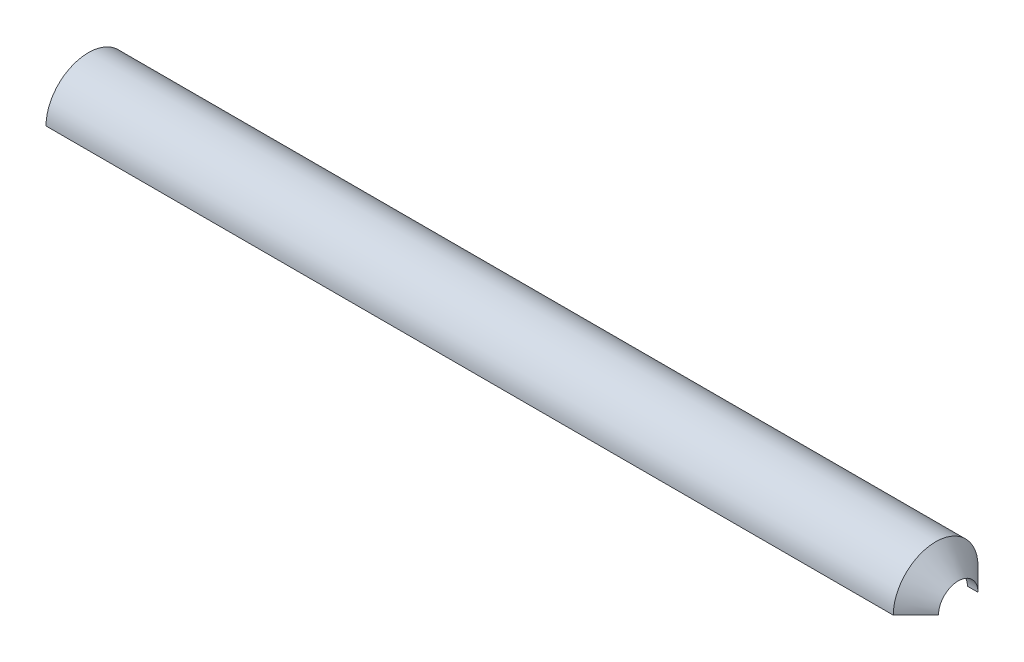
ISO-10303-21;
HEADER;
FILE_DESCRIPTION(('STEP AP214'),'2;1');
FILE_NAME('part.step','',(''),(''),'','','');
FILE_SCHEMA(('AUTOMOTIVE_DESIGN { 1 0 10303 214 1 1 1 1 }'));
ENDSEC;
DATA;
#1=APPLICATION_CONTEXT('core data for automotive mechanical design processes');
#2=APPLICATION_PROTOCOL_DEFINITION('international standard','automotive_design',2000,#1);
#3=PRODUCT_CONTEXT('',#1,'mechanical');
#4=PRODUCT('Part','Part','',(#3));
#5=PRODUCT_RELATED_PRODUCT_CATEGORY('part','',(#4));
#6=PRODUCT_DEFINITION_FORMATION('','',#4);
#7=PRODUCT_DEFINITION_CONTEXT('part definition',#1,'design');
#8=PRODUCT_DEFINITION('design','',#6,#7);
#9=PRODUCT_DEFINITION_SHAPE('','',#8);
#10=(LENGTH_UNIT() NAMED_UNIT(*) SI_UNIT(.MILLI.,.METRE.));
#11=(NAMED_UNIT(*) PLANE_ANGLE_UNIT() SI_UNIT($,.RADIAN.));
#12=(NAMED_UNIT(*) SI_UNIT($,.STERADIAN.) SOLID_ANGLE_UNIT());
#13=UNCERTAINTY_MEASURE_WITH_UNIT(LENGTH_MEASURE(1.E-05),#10,'distance_accuracy_value','');
#14=(GEOMETRIC_REPRESENTATION_CONTEXT(3) GLOBAL_UNCERTAINTY_ASSIGNED_CONTEXT((#13)) GLOBAL_UNIT_ASSIGNED_CONTEXT((#10,
#11,#12)) REPRESENTATION_CONTEXT('',''));
#15=CARTESIAN_POINT('',(0.,0.,0.));
#16=DIRECTION('',(0.,0.,1.));
#17=DIRECTION('',(1.,0.,0.));
#18=AXIS2_PLACEMENT_3D('',#15,#16,#17);
#19=CARTESIAN_POINT('',(60.,0.,0.));
#20=DIRECTION('',(-1.,0.,0.));
#21=DIRECTION('',(0.,0.,1.));
#22=AXIS2_PLACEMENT_3D('',#19,#20,#21);
#23=CYLINDRICAL_SURFACE('',#22,4.5);
#24=CARTESIAN_POINT('',(-55.,0.,0.));
#25=DIRECTION('',(-1.,0.,0.));
#26=DIRECTION('',(0.,0.,1.));
#27=AXIS2_PLACEMENT_3D('',#24,#25,#26);
#28=CIRCLE('',#27,4.5);
#29=CARTESIAN_POINT('',(-55.,0.,4.5));
#30=VERTEX_POINT('',#29);
#31=CARTESIAN_POINT('',(-55.,0.,-4.5));
#32=VERTEX_POINT('',#31);
#33=EDGE_CURVE('E58',#30,#32,#28,.T.);
#34=ORIENTED_EDGE('',*,*,#33,.T.);
#35=DIRECTION('',(-1.,0.,0.));
#36=VECTOR('',#35,1.);
#37=CARTESIAN_POINT('',(60.,0.,-4.5));
#38=LINE('',#37,#36);
#39=CARTESIAN_POINT('',(60.,0.,-4.5));
#40=VERTEX_POINT('',#39);
#41=EDGE_CURVE('E154',#40,#32,#38,.T.);
#42=ORIENTED_EDGE('',*,*,#41,.F.);
#43=CARTESIAN_POINT('',(60.,0.,0.));
#44=DIRECTION('',(-1.,0.,0.));
#45=DIRECTION('',(0.,0.,-1.));
#46=AXIS2_PLACEMENT_3D('',#43,#44,#45);
#47=CIRCLE('',#46,4.5);
#48=CARTESIAN_POINT('',(60.,0.,4.5));
#49=VERTEX_POINT('',#48);
#50=EDGE_CURVE('E141',#49,#40,#47,.T.);
#51=ORIENTED_EDGE('',*,*,#50,.F.);
#52=DIRECTION('',(-1.,0.,0.));
#53=VECTOR('',#52,1.);
#54=CARTESIAN_POINT('',(60.,0.,4.5));
#55=LINE('',#54,#53);
#56=EDGE_CURVE('E48',#49,#30,#55,.T.);
#57=ORIENTED_EDGE('',*,*,#56,.T.);
#58=EDGE_LOOP('',(#34,#42,#51,#57));
#59=FACE_BOUND('',#58,.T.);
#60=ADVANCED_FACE('F39',(#59),#23,.F.);
#61=CARTESIAN_POINT('',(60.,0.,0.));
#62=DIRECTION('',(-1.,0.,0.));
#63=DIRECTION('',(0.,0.,1.));
#64=AXIS2_PLACEMENT_3D('',#61,#62,#63);
#65=CYLINDRICAL_SURFACE('',#64,6.);
#66=CARTESIAN_POINT('',(-60.,0.,0.));
#67=DIRECTION('',(1.,0.,0.));
#68=DIRECTION('',(0.,0.,-1.));
#69=AXIS2_PLACEMENT_3D('',#66,#67,#68);
#70=CIRCLE('',#69,6.);
#71=CARTESIAN_POINT('',(-60.,0.,-6.));
#72=VERTEX_POINT('',#71);
#73=CARTESIAN_POINT('',(-60.,0.,6.));
#74=VERTEX_POINT('',#73);
#75=EDGE_CURVE('E136',#72,#74,#70,.T.);
#76=ORIENTED_EDGE('',*,*,#75,.T.);
#77=DIRECTION('',(-1.,0.,0.));
#78=VECTOR('',#77,1.);
#79=CARTESIAN_POINT('',(60.,0.,6.));
#80=LINE('',#79,#78);
#81=CARTESIAN_POINT('',(60.,0.,6.));
#82=VERTEX_POINT('',#81);
#83=EDGE_CURVE('E11',#82,#74,#80,.T.);
#84=ORIENTED_EDGE('',*,*,#83,.F.);
#85=CARTESIAN_POINT('',(60.,0.,0.));
#86=DIRECTION('',(1.,0.,0.));
#87=DIRECTION('',(0.,0.,-1.));
#88=AXIS2_PLACEMENT_3D('',#85,#86,#87);
#89=CIRCLE('',#88,6.);
#90=CARTESIAN_POINT('',(60.,0.,-6.));
#91=VERTEX_POINT('',#90);
#92=EDGE_CURVE('E137',#91,#82,#89,.T.);
#93=ORIENTED_EDGE('',*,*,#92,.F.);
#94=DIRECTION('',(-1.,0.,0.));
#95=VECTOR('',#94,1.);
#96=CARTESIAN_POINT('',(60.,0.,-6.));
#97=LINE('',#96,#95);
#98=EDGE_CURVE('E145',#91,#72,#97,.T.);
#99=ORIENTED_EDGE('',*,*,#98,.T.);
#100=EDGE_LOOP('',(#76,#84,#93,#99));
#101=FACE_BOUND('',#100,.T.);
#102=ADVANCED_FACE('F41',(#101),#65,.T.);
#103=CARTESIAN_POINT('',(60.,0.,-4.5));
#104=DIRECTION('',(0.,1.,0.));
#105=DIRECTION('',(0.,0.,1.));
#106=AXIS2_PLACEMENT_3D('',#103,#104,#105);
#107=PLANE('',#106);
#108=DIRECTION('',(0.,0.,-1.));
#109=VECTOR('',#108,1.);
#110=CARTESIAN_POINT('',(-60.,0.,-4.5));
#111=LINE('',#110,#109);
#112=EDGE_CURVE('E142',#74,#72,#111,.T.);
#113=ORIENTED_EDGE('',*,*,#112,.T.);
#114=ORIENTED_EDGE('',*,*,#98,.F.);
#115=DIRECTION('',(-0.707106781186551,0.,-0.707106781186544));
#116=VECTOR('',#115,1.);
#117=CARTESIAN_POINT('',(60.,0.,-6.));
#118=LINE('',#117,#116);
#119=CARTESIAN_POINT('',(63.2,0.,-2.8));
#120=VERTEX_POINT('',#119);
#121=EDGE_CURVE('E125',#120,#91,#118,.T.);
#122=ORIENTED_EDGE('',*,*,#121,.F.);
#123=DIRECTION('',(1.,0.,0.));
#124=VECTOR('',#123,1.);
#125=CARTESIAN_POINT('',(61.7,0.,-2.8));
#126=LINE('',#125,#124);
#127=CARTESIAN_POINT('',(61.7,0.,-2.8));
#128=VERTEX_POINT('',#127);
#129=EDGE_CURVE('E122',#128,#120,#126,.T.);
#130=ORIENTED_EDGE('',*,*,#129,.F.);
#131=DIRECTION('',(0.707106781186552,0.,0.707106781186543));
#132=VECTOR('',#131,1.);
#133=CARTESIAN_POINT('',(60.,0.,-4.5));
#134=LINE('',#133,#132);
#135=EDGE_CURVE('E96',#40,#128,#134,.T.);
#136=ORIENTED_EDGE('',*,*,#135,.F.);
#137=ORIENTED_EDGE('',*,*,#41,.T.);
#138=DIRECTION('',(0.,0.,1.));
#139=VECTOR('',#138,1.);
#140=CARTESIAN_POINT('',(-55.,0.,-4.5));
#141=LINE('',#140,#139);
#142=EDGE_CURVE('E133',#32,#30,#141,.T.);
#143=ORIENTED_EDGE('',*,*,#142,.T.);
#144=ORIENTED_EDGE('',*,*,#56,.F.);
#145=DIRECTION('',(0.707106781186552,0.,-0.707106781186543));
#146=VECTOR('',#145,1.);
#147=CARTESIAN_POINT('',(60.,0.,4.5));
#148=LINE('',#147,#146);
#149=CARTESIAN_POINT('',(61.7,0.,2.8));
#150=VERTEX_POINT('',#149);
#151=EDGE_CURVE('E94',#49,#150,#148,.T.);
#152=ORIENTED_EDGE('',*,*,#151,.T.);
#153=DIRECTION('',(1.,0.,0.));
#154=VECTOR('',#153,1.);
#155=CARTESIAN_POINT('',(61.7,0.,2.8));
#156=LINE('',#155,#154);
#157=CARTESIAN_POINT('',(63.2,0.,2.8));
#158=VERTEX_POINT('',#157);
#159=EDGE_CURVE('E108',#150,#158,#156,.T.);
#160=ORIENTED_EDGE('',*,*,#159,.T.);
#161=DIRECTION('',(-0.707106781186551,0.,0.707106781186544));
#162=VECTOR('',#161,1.);
#163=CARTESIAN_POINT('',(60.,0.,6.));
#164=LINE('',#163,#162);
#165=EDGE_CURVE('E115',#158,#82,#164,.T.);
#166=ORIENTED_EDGE('',*,*,#165,.T.);
#167=ORIENTED_EDGE('',*,*,#83,.T.);
#168=EDGE_LOOP('',(#113,#114,#122,#130,#136,#137,#143,#144,#152,#160,#166,#167));
#169=FACE_BOUND('',#168,.T.);
#170=ADVANCED_FACE('F106',(#169),#107,.F.);
#171=CARTESIAN_POINT('',(-60.,0.,0.));
#172=DIRECTION('',(1.,0.,0.));
#173=DIRECTION('',(0.,0.,-1.));
#174=AXIS2_PLACEMENT_3D('',#171,#172,#173);
#175=PLANE('',#174);
#176=ORIENTED_EDGE('',*,*,#75,.F.);
#177=ORIENTED_EDGE('',*,*,#112,.F.);
#178=EDGE_LOOP('',(#176,#177));
#179=FACE_BOUND('',#178,.T.);
#180=ADVANCED_FACE('F161',(#179),#175,.F.);
#181=CARTESIAN_POINT('',(-55.,0.,0.));
#182=DIRECTION('',(-1.,0.,0.));
#183=DIRECTION('',(0.,0.,1.));
#184=AXIS2_PLACEMENT_3D('',#181,#182,#183);
#185=PLANE('',#184);
#186=ORIENTED_EDGE('',*,*,#33,.F.);
#187=ORIENTED_EDGE('',*,*,#142,.F.);
#188=EDGE_LOOP('',(#186,#187));
#189=FACE_BOUND('',#188,.T.);
#190=ADVANCED_FACE('F159',(#189),#185,.F.);
#191=CARTESIAN_POINT('',(60.,0.,0.));
#192=DIRECTION('',(-1.,0.,0.));
#193=DIRECTION('',(0.,0.,1.));
#194=AXIS2_PLACEMENT_3D('',#191,#192,#193);
#195=CONICAL_SURFACE('',#194,4.5,0.785398163397442);
#196=CARTESIAN_POINT('',(61.7,0.,0.));
#197=DIRECTION('',(1.,0.,0.));
#198=DIRECTION('',(0.,0.,-1.));
#199=AXIS2_PLACEMENT_3D('',#196,#197,#198);
#200=CIRCLE('',#199,2.8);
#201=EDGE_CURVE('E90',#128,#150,#200,.T.);
#202=ORIENTED_EDGE('',*,*,#201,.T.);
#203=ORIENTED_EDGE('',*,*,#151,.F.);
#204=ORIENTED_EDGE('',*,*,#50,.T.);
#205=ORIENTED_EDGE('',*,*,#135,.T.);
#206=EDGE_LOOP('',(#202,#203,#204,#205));
#207=FACE_BOUND('',#206,.T.);
#208=ADVANCED_FACE('F92',(#207),#195,.F.);
#209=CARTESIAN_POINT('',(0.,0.,0.));
#210=DIRECTION('',(1.,0.,0.));
#211=DIRECTION('',(0.,0.,-1.));
#212=AXIS2_PLACEMENT_3D('',#209,#210,#211);
#213=CYLINDRICAL_SURFACE('',#212,2.8);
#214=CARTESIAN_POINT('',(63.2,0.,0.));
#215=DIRECTION('',(1.,0.,0.));
#216=DIRECTION('',(0.,0.,-1.));
#217=AXIS2_PLACEMENT_3D('',#214,#215,#216);
#218=CIRCLE('',#217,2.8);
#219=EDGE_CURVE('E102',#120,#158,#218,.T.);
#220=ORIENTED_EDGE('',*,*,#219,.T.);
#221=ORIENTED_EDGE('',*,*,#159,.F.);
#222=ORIENTED_EDGE('',*,*,#201,.F.);
#223=ORIENTED_EDGE('',*,*,#129,.T.);
#224=EDGE_LOOP('',(#220,#221,#222,#223));
#225=FACE_BOUND('',#224,.T.);
#226=ADVANCED_FACE('F113',(#225),#213,.F.);
#227=CARTESIAN_POINT('',(63.2,0.,0.));
#228=DIRECTION('',(-1.,0.,0.));
#229=DIRECTION('',(0.,0.,1.));
#230=AXIS2_PLACEMENT_3D('',#227,#228,#229);
#231=CONICAL_SURFACE('',#230,2.8,0.785398163397443);
#232=ORIENTED_EDGE('',*,*,#121,.T.);
#233=ORIENTED_EDGE('',*,*,#92,.T.);
#234=ORIENTED_EDGE('',*,*,#165,.F.);
#235=ORIENTED_EDGE('',*,*,#219,.F.);
#236=EDGE_LOOP('',(#232,#233,#234,#235));
#237=FACE_BOUND('',#236,.T.);
#238=ADVANCED_FACE('F229',(#237),#231,.T.);
#239=CLOSED_SHELL('',(#60,#102,#170,#180,#190,#208,#226,#238));
#240=MANIFOLD_SOLID_BREP('B2',#239);
#241=ADVANCED_BREP_SHAPE_REPRESENTATION('',(#18,#240),#14);
#242=SHAPE_DEFINITION_REPRESENTATION(#9,#241);
ENDSEC;
END-ISO-10303-21;
